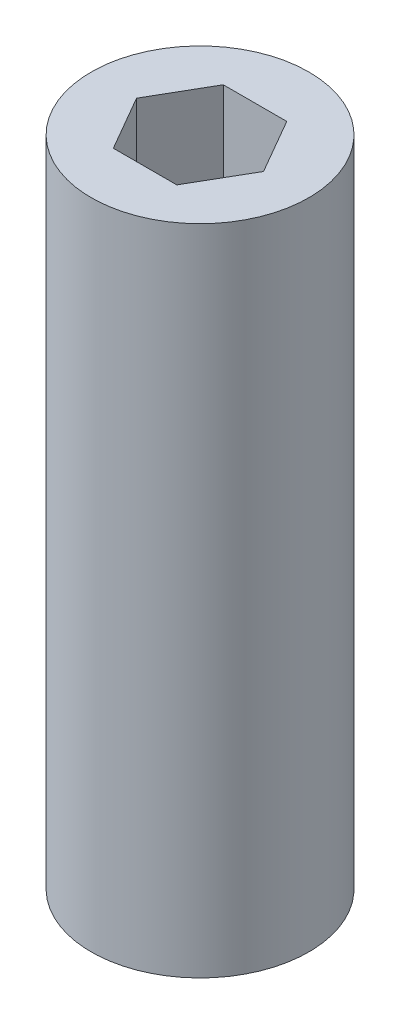
ISO-10303-21;
HEADER;
FILE_DESCRIPTION(('STEP AP214'),'2;1');
FILE_NAME('part.step','',(''),(''),'','','');
FILE_SCHEMA(('AUTOMOTIVE_DESIGN { 1 0 10303 214 1 1 1 1 }'));
ENDSEC;
DATA;
#1=APPLICATION_CONTEXT('core data for automotive mechanical design processes');
#2=APPLICATION_PROTOCOL_DEFINITION('international standard','automotive_design',2000,#1);
#3=PRODUCT_CONTEXT('',#1,'mechanical');
#4=PRODUCT('Part','Part','',(#3));
#5=PRODUCT_RELATED_PRODUCT_CATEGORY('part','',(#4));
#6=PRODUCT_DEFINITION_FORMATION('','',#4);
#7=PRODUCT_DEFINITION_CONTEXT('part definition',#1,'design');
#8=PRODUCT_DEFINITION('design','',#6,#7);
#9=PRODUCT_DEFINITION_SHAPE('','',#8);
#10=(LENGTH_UNIT() NAMED_UNIT(*) SI_UNIT(.MILLI.,.METRE.));
#11=(NAMED_UNIT(*) PLANE_ANGLE_UNIT() SI_UNIT($,.RADIAN.));
#12=(NAMED_UNIT(*) SI_UNIT($,.STERADIAN.) SOLID_ANGLE_UNIT());
#13=UNCERTAINTY_MEASURE_WITH_UNIT(LENGTH_MEASURE(1.E-05),#10,'distance_accuracy_value','');
#14=(GEOMETRIC_REPRESENTATION_CONTEXT(3) GLOBAL_UNCERTAINTY_ASSIGNED_CONTEXT((#13)) GLOBAL_UNIT_ASSIGNED_CONTEXT((#10,
#11,#12)) REPRESENTATION_CONTEXT('',''));
#15=CARTESIAN_POINT('',(0.,0.,0.));
#16=DIRECTION('',(0.,0.,1.));
#17=DIRECTION('',(1.,0.,0.));
#18=AXIS2_PLACEMENT_3D('',#15,#16,#17);
#19=CARTESIAN_POINT('',(0.,76.2,0.));
#20=DIRECTION('',(0.,-1.,0.));
#21=DIRECTION('',(0.,0.,-1.));
#22=AXIS2_PLACEMENT_3D('',#19,#20,#21);
#23=CYLINDRICAL_SURFACE('',#22,12.7);
#24=CARTESIAN_POINT('',(0.,76.2,0.));
#25=DIRECTION('',(0.,1.,0.));
#26=DIRECTION('',(0.,0.,1.));
#27=AXIS2_PLACEMENT_3D('',#24,#25,#26);
#28=CIRCLE('',#27,12.7);
#29=CARTESIAN_POINT('',(0.,76.2,-12.7));
#30=VERTEX_POINT('',#29);
#31=EDGE_CURVE('E11',#30,#30,#28,.T.);
#32=CARTESIAN_POINT('',(0.,0.,0.));
#33=DIRECTION('',(0.,1.,0.));
#34=DIRECTION('',(0.,0.,1.));
#35=AXIS2_PLACEMENT_3D('',#32,#33,#34);
#36=CIRCLE('',#35,12.7);
#37=CARTESIAN_POINT('',(0.,0.,-12.7));
#38=VERTEX_POINT('',#37);
#39=EDGE_CURVE('E42',#38,#38,#36,.T.);
#40=CARTESIAN_POINT('',(0.,76.2,-12.7));
#41=CARTESIAN_POINT('',(0.,75.40625,-12.7));
#42=CARTESIAN_POINT('',(0.,74.6125,-12.7));
#43=CARTESIAN_POINT('',(0.,73.025,-12.7));
#44=CARTESIAN_POINT('',(0.,72.23125,-12.7));
#45=CARTESIAN_POINT('',(0.,70.64375,-12.7));
#46=CARTESIAN_POINT('',(0.,69.85,-12.7));
#47=CARTESIAN_POINT('',(0.,68.2625,-12.7));
#48=CARTESIAN_POINT('',(0.,67.46875,-12.7));
#49=CARTESIAN_POINT('',(0.,65.88125,-12.7));
#50=CARTESIAN_POINT('',(0.,65.0875,-12.7));
#51=CARTESIAN_POINT('',(0.,63.5,-12.7));
#52=CARTESIAN_POINT('',(0.,62.70625,-12.7));
#53=CARTESIAN_POINT('',(0.,61.11875,-12.7));
#54=CARTESIAN_POINT('',(0.,60.325,-12.7));
#55=CARTESIAN_POINT('',(0.,58.7375,-12.7));
#56=CARTESIAN_POINT('',(0.,57.94375,-12.7));
#57=CARTESIAN_POINT('',(0.,56.35625,-12.7));
#58=CARTESIAN_POINT('',(0.,55.5625,-12.7));
#59=CARTESIAN_POINT('',(0.,53.975,-12.7));
#60=CARTESIAN_POINT('',(0.,53.18125,-12.7));
#61=CARTESIAN_POINT('',(0.,51.59375,-12.7));
#62=CARTESIAN_POINT('',(0.,50.8,-12.7));
#63=CARTESIAN_POINT('',(0.,49.2125,-12.7));
#64=CARTESIAN_POINT('',(0.,48.41875,-12.7));
#65=CARTESIAN_POINT('',(0.,46.83125,-12.7));
#66=CARTESIAN_POINT('',(0.,46.0375,-12.7));
#67=CARTESIAN_POINT('',(0.,44.45,-12.7));
#68=CARTESIAN_POINT('',(0.,43.65625,-12.7));
#69=CARTESIAN_POINT('',(0.,42.06875,-12.7));
#70=CARTESIAN_POINT('',(0.,41.275,-12.7));
#71=CARTESIAN_POINT('',(0.,39.6875,-12.7));
#72=CARTESIAN_POINT('',(0.,38.89375,-12.7));
#73=CARTESIAN_POINT('',(0.,37.30625,-12.7));
#74=CARTESIAN_POINT('',(0.,36.5125,-12.7));
#75=CARTESIAN_POINT('',(0.,34.925,-12.7));
#76=CARTESIAN_POINT('',(0.,34.13125,-12.7));
#77=CARTESIAN_POINT('',(0.,32.54375,-12.7));
#78=CARTESIAN_POINT('',(0.,31.75,-12.7));
#79=CARTESIAN_POINT('',(0.,30.1625,-12.7));
#80=CARTESIAN_POINT('',(0.,29.36875,-12.7));
#81=CARTESIAN_POINT('',(0.,27.78125,-12.7));
#82=CARTESIAN_POINT('',(0.,26.9875,-12.7));
#83=CARTESIAN_POINT('',(0.,25.4,-12.7));
#84=CARTESIAN_POINT('',(0.,24.60625,-12.7));
#85=CARTESIAN_POINT('',(0.,23.01875,-12.7));
#86=CARTESIAN_POINT('',(0.,22.225,-12.7));
#87=CARTESIAN_POINT('',(0.,20.6375,-12.7));
#88=CARTESIAN_POINT('',(0.,19.84375,-12.7));
#89=CARTESIAN_POINT('',(0.,18.25625,-12.7));
#90=CARTESIAN_POINT('',(0.,17.4625,-12.7));
#91=CARTESIAN_POINT('',(0.,15.875,-12.7));
#92=CARTESIAN_POINT('',(0.,15.08125,-12.7));
#93=CARTESIAN_POINT('',(0.,13.49375,-12.7));
#94=CARTESIAN_POINT('',(0.,12.7,-12.7));
#95=CARTESIAN_POINT('',(0.,11.1125,-12.7));
#96=CARTESIAN_POINT('',(0.,10.31875,-12.7));
#97=CARTESIAN_POINT('',(0.,8.73125,-12.7));
#98=CARTESIAN_POINT('',(0.,7.93750000000001,-12.7));
#99=CARTESIAN_POINT('',(0.,6.35,-12.7));
#100=CARTESIAN_POINT('',(0.,5.55625,-12.7));
#101=CARTESIAN_POINT('',(0.,3.96875,-12.7));
#102=CARTESIAN_POINT('',(0.,3.175,-12.7));
#103=CARTESIAN_POINT('',(0.,1.5875,-12.7));
#104=CARTESIAN_POINT('',(0.,0.793750000000001,-12.7));
#105=CARTESIAN_POINT('',(0.,0.,-12.7));
#106=B_SPLINE_CURVE_WITH_KNOTS('',3,(#40,#41,#42,#43,#44,#45,#46,#47,#48,#49,#50,#51,#52,#53,
#54,#55,#56,#57,#58,#59,#60,#61,#62,#63,#64,#65,#66,#67,#68,#69,#70,#71,#72,#73,#74,#75,#76,#77,
#78,#79,#80,#81,#82,#83,#84,#85,#86,#87,#88,#89,#90,#91,#92,#93,#94,#95,#96,#97,#98,#99,#100,
#101,#102,#103,#104,#105),.UNSPECIFIED.,.F.,.F.,(4,2,2,2,2,2,2,2,2,2,2,2,2,2,2,2,2,2,2,2,2,2,2,
2,2,2,2,2,2,2,2,2,4),(0.,2.38124999999999,4.76249999999999,7.14374999999999,9.52499999999999,
11.90625,14.2875,16.66875,19.05,21.43125,23.8125,26.19375,28.575,30.95625,33.3375,35.71875,38.1,
40.48125,42.8625,45.24375,47.625,50.00625,52.3875,54.76875,57.15,59.53125,61.9125,64.29375,
66.675,69.05625,71.4375,73.81875,76.2),.UNSPECIFIED.);
#107=EDGE_CURVE('BSEAM39',#30,#38,#106,.T.);
#108=ORIENTED_EDGE('',*,*,#31,.F.);
#109=ORIENTED_EDGE('',*,*,#39,.T.);
#110=ORIENTED_EDGE('',*,*,#107,.T.);
#111=ORIENTED_EDGE('',*,*,#107,.F.);
#112=EDGE_LOOP('',(#108,#110,#109,#111));
#113=FACE_BOUND('',#112,.T.);
#114=ADVANCED_FACE('F39',(#113),#23,.T.);
#115=CARTESIAN_POINT('',(0.,76.2,0.));
#116=DIRECTION('',(0.,1.,0.));
#117=DIRECTION('',(0.,0.,1.));
#118=AXIS2_PLACEMENT_3D('',#115,#116,#117);
#119=PLANE('',#118);
#120=DIRECTION('',(0.5,0.,0.866025403784438));
#121=VECTOR('',#120,1.);
#122=CARTESIAN_POINT('',(3.70283595144767,76.2,-6.4135));
#123=LINE('',#122,#121);
#124=CARTESIAN_POINT('',(3.70283595144767,76.2,-6.4135));
#125=VERTEX_POINT('',#124);
#126=CARTESIAN_POINT('',(7.40567190289533,76.2,0.));
#127=VERTEX_POINT('',#126);
#128=EDGE_CURVE('E94',#125,#127,#123,.T.);
#129=ORIENTED_EDGE('',*,*,#128,.T.);
#130=DIRECTION('',(-0.5,0.,0.866025403784439));
#131=VECTOR('',#130,1.);
#132=CARTESIAN_POINT('',(7.40567190289533,76.2,0.));
#133=LINE('',#132,#131);
#134=CARTESIAN_POINT('',(3.70283595144767,76.2,6.4135));
#135=VERTEX_POINT('',#134);
#136=EDGE_CURVE('E104',#127,#135,#133,.T.);
#137=ORIENTED_EDGE('',*,*,#136,.T.);
#138=DIRECTION('',(-1.,0.,0.));
#139=VECTOR('',#138,1.);
#140=CARTESIAN_POINT('',(3.70283595144767,76.2,6.4135));
#141=LINE('',#140,#139);
#142=CARTESIAN_POINT('',(-3.70283595144767,76.2,6.4135));
#143=VERTEX_POINT('',#142);
#144=EDGE_CURVE('E54',#135,#143,#141,.T.);
#145=ORIENTED_EDGE('',*,*,#144,.T.);
#146=DIRECTION('',(-0.5,0.,-0.866025403784439));
#147=VECTOR('',#146,1.);
#148=CARTESIAN_POINT('',(-3.70283595144767,76.2,6.4135));
#149=LINE('',#148,#147);
#150=CARTESIAN_POINT('',(-7.40567190289533,76.2,0.));
#151=VERTEX_POINT('',#150);
#152=EDGE_CURVE('E123',#143,#151,#149,.T.);
#153=ORIENTED_EDGE('',*,*,#152,.T.);
#154=DIRECTION('',(0.5,0.,-0.866025403784439));
#155=VECTOR('',#154,1.);
#156=CARTESIAN_POINT('',(-7.40567190289533,76.2,0.));
#157=LINE('',#156,#155);
#158=CARTESIAN_POINT('',(-3.70283595144767,76.2,-6.4135));
#159=VERTEX_POINT('',#158);
#160=EDGE_CURVE('E127',#151,#159,#157,.T.);
#161=ORIENTED_EDGE('',*,*,#160,.T.);
#162=DIRECTION('',(1.,0.,0.));
#163=VECTOR('',#162,1.);
#164=CARTESIAN_POINT('',(-3.70283595144767,76.2,-6.4135));
#165=LINE('',#164,#163);
#166=EDGE_CURVE('E101',#159,#125,#165,.T.);
#167=ORIENTED_EDGE('',*,*,#166,.T.);
#168=EDGE_LOOP('',(#129,#137,#145,#153,#161,#167));
#169=FACE_BOUND('',#168,.T.);
#170=ORIENTED_EDGE('',*,*,#31,.T.);
#171=EDGE_LOOP('',(#170));
#172=FACE_BOUND('',#171,.T.);
#173=ADVANCED_FACE('F109',(#169,#172),#119,.T.);
#174=CARTESIAN_POINT('',(0.,0.,0.));
#175=DIRECTION('',(0.,1.,0.));
#176=DIRECTION('',(0.,0.,1.));
#177=AXIS2_PLACEMENT_3D('',#174,#175,#176);
#178=PLANE('',#177);
#179=DIRECTION('',(-0.5,0.,0.866025403784439));
#180=VECTOR('',#179,1.);
#181=CARTESIAN_POINT('',(7.40567190289533,0.,0.));
#182=LINE('',#181,#180);
#183=CARTESIAN_POINT('',(7.40567190289533,0.,0.));
#184=VERTEX_POINT('',#183);
#185=CARTESIAN_POINT('',(3.70283595144767,0.,6.4135));
#186=VERTEX_POINT('',#185);
#187=EDGE_CURVE('E134',#184,#186,#182,.T.);
#188=ORIENTED_EDGE('',*,*,#187,.F.);
#189=DIRECTION('',(0.5,0.,0.866025403784438));
#190=VECTOR('',#189,1.);
#191=CARTESIAN_POINT('',(3.70283595144767,0.,-6.4135));
#192=LINE('',#191,#190);
#193=CARTESIAN_POINT('',(3.70283595144767,0.,-6.4135));
#194=VERTEX_POINT('',#193);
#195=EDGE_CURVE('E62',#194,#184,#192,.T.);
#196=ORIENTED_EDGE('',*,*,#195,.F.);
#197=DIRECTION('',(1.,0.,0.));
#198=VECTOR('',#197,1.);
#199=CARTESIAN_POINT('',(-3.70283595144767,0.,-6.4135));
#200=LINE('',#199,#198);
#201=CARTESIAN_POINT('',(-3.70283595144767,0.,-6.4135));
#202=VERTEX_POINT('',#201);
#203=EDGE_CURVE('E114',#202,#194,#200,.T.);
#204=ORIENTED_EDGE('',*,*,#203,.F.);
#205=DIRECTION('',(0.5,0.,-0.866025403784439));
#206=VECTOR('',#205,1.);
#207=CARTESIAN_POINT('',(-7.40567190289533,0.,0.));
#208=LINE('',#207,#206);
#209=CARTESIAN_POINT('',(-7.40567190289533,0.,0.));
#210=VERTEX_POINT('',#209);
#211=EDGE_CURVE('E118',#210,#202,#208,.T.);
#212=ORIENTED_EDGE('',*,*,#211,.F.);
#213=DIRECTION('',(-0.5,0.,-0.866025403784439));
#214=VECTOR('',#213,1.);
#215=CARTESIAN_POINT('',(-3.70283595144767,0.,6.4135));
#216=LINE('',#215,#214);
#217=CARTESIAN_POINT('',(-3.70283595144767,0.,6.4135));
#218=VERTEX_POINT('',#217);
#219=EDGE_CURVE('E141',#218,#210,#216,.T.);
#220=ORIENTED_EDGE('',*,*,#219,.F.);
#221=DIRECTION('',(-1.,0.,0.));
#222=VECTOR('',#221,1.);
#223=CARTESIAN_POINT('',(3.70283595144767,0.,6.4135));
#224=LINE('',#223,#222);
#225=EDGE_CURVE('E137',#186,#218,#224,.T.);
#226=ORIENTED_EDGE('',*,*,#225,.F.);
#227=EDGE_LOOP('',(#188,#196,#204,#212,#220,#226));
#228=FACE_BOUND('',#227,.T.);
#229=ORIENTED_EDGE('',*,*,#39,.F.);
#230=EDGE_LOOP('',(#229));
#231=FACE_BOUND('',#230,.T.);
#232=ADVANCED_FACE('F165',(#228,#231),#178,.F.);
#233=CARTESIAN_POINT('',(3.70283595144767,76.2,-6.4135));
#234=DIRECTION('',(0.866025403784439,0.,-0.5));
#235=DIRECTION('',(-0.5,0.,-0.866025403784438));
#236=AXIS2_PLACEMENT_3D('',#233,#234,#235);
#237=PLANE('',#236);
#238=ORIENTED_EDGE('',*,*,#195,.T.);
#239=DIRECTION('',(0.,-1.,0.));
#240=VECTOR('',#239,1.);
#241=CARTESIAN_POINT('',(7.40567190289533,76.2,0.));
#242=LINE('',#241,#240);
#243=EDGE_CURVE('E90',#127,#184,#242,.T.);
#244=ORIENTED_EDGE('',*,*,#243,.F.);
#245=ORIENTED_EDGE('',*,*,#128,.F.);
#246=DIRECTION('',(0.,-1.,0.));
#247=VECTOR('',#246,1.);
#248=CARTESIAN_POINT('',(3.70283595144767,76.2,-6.4135));
#249=LINE('',#248,#247);
#250=EDGE_CURVE('E148',#125,#194,#249,.T.);
#251=ORIENTED_EDGE('',*,*,#250,.T.);
#252=EDGE_LOOP('',(#238,#244,#245,#251));
#253=FACE_BOUND('',#252,.T.);
#254=ADVANCED_FACE('F92',(#253),#237,.F.);
#255=CARTESIAN_POINT('',(-3.70283595144767,76.2,-6.4135));
#256=DIRECTION('',(0.,0.,-1.));
#257=DIRECTION('',(-1.,0.,0.));
#258=AXIS2_PLACEMENT_3D('',#255,#256,#257);
#259=PLANE('',#258);
#260=ORIENTED_EDGE('',*,*,#203,.T.);
#261=ORIENTED_EDGE('',*,*,#250,.F.);
#262=ORIENTED_EDGE('',*,*,#166,.F.);
#263=DIRECTION('',(0.,-1.,0.));
#264=VECTOR('',#263,1.);
#265=CARTESIAN_POINT('',(-3.70283595144767,76.2,-6.4135));
#266=LINE('',#265,#264);
#267=EDGE_CURVE('E151',#159,#202,#266,.T.);
#268=ORIENTED_EDGE('',*,*,#267,.T.);
#269=EDGE_LOOP('',(#260,#261,#262,#268));
#270=FACE_BOUND('',#269,.T.);
#271=ADVANCED_FACE('F176',(#270),#259,.F.);
#272=CARTESIAN_POINT('',(-7.40567190289533,76.2,0.));
#273=DIRECTION('',(-0.866025403784439,0.,-0.5));
#274=DIRECTION('',(-0.5,0.,0.866025403784439));
#275=AXIS2_PLACEMENT_3D('',#272,#273,#274);
#276=PLANE('',#275);
#277=ORIENTED_EDGE('',*,*,#211,.T.);
#278=ORIENTED_EDGE('',*,*,#267,.F.);
#279=ORIENTED_EDGE('',*,*,#160,.F.);
#280=DIRECTION('',(0.,-1.,0.));
#281=VECTOR('',#280,1.);
#282=CARTESIAN_POINT('',(-7.40567190289533,76.2,0.));
#283=LINE('',#282,#281);
#284=EDGE_CURVE('E154',#151,#210,#283,.T.);
#285=ORIENTED_EDGE('',*,*,#284,.T.);
#286=EDGE_LOOP('',(#277,#278,#279,#285));
#287=FACE_BOUND('',#286,.T.);
#288=ADVANCED_FACE('F174',(#287),#276,.F.);
#289=CARTESIAN_POINT('',(-3.70283595144767,76.2,6.4135));
#290=DIRECTION('',(-0.866025403784439,0.,0.5));
#291=DIRECTION('',(0.5,0.,0.866025403784439));
#292=AXIS2_PLACEMENT_3D('',#289,#290,#291);
#293=PLANE('',#292);
#294=ORIENTED_EDGE('',*,*,#219,.T.);
#295=ORIENTED_EDGE('',*,*,#284,.F.);
#296=ORIENTED_EDGE('',*,*,#152,.F.);
#297=DIRECTION('',(0.,-1.,0.));
#298=VECTOR('',#297,1.);
#299=CARTESIAN_POINT('',(-3.70283595144767,76.2,6.4135));
#300=LINE('',#299,#298);
#301=EDGE_CURVE('E157',#143,#218,#300,.T.);
#302=ORIENTED_EDGE('',*,*,#301,.T.);
#303=EDGE_LOOP('',(#294,#295,#296,#302));
#304=FACE_BOUND('',#303,.T.);
#305=ADVANCED_FACE('F170',(#304),#293,.F.);
#306=CARTESIAN_POINT('',(3.70283595144767,76.2,6.4135));
#307=DIRECTION('',(0.,0.,1.));
#308=DIRECTION('',(1.,0.,0.));
#309=AXIS2_PLACEMENT_3D('',#306,#307,#308);
#310=PLANE('',#309);
#311=ORIENTED_EDGE('',*,*,#225,.T.);
#312=ORIENTED_EDGE('',*,*,#301,.F.);
#313=ORIENTED_EDGE('',*,*,#144,.F.);
#314=DIRECTION('',(0.,-1.,0.));
#315=VECTOR('',#314,1.);
#316=CARTESIAN_POINT('',(3.70283595144767,76.2,6.4135));
#317=LINE('',#316,#315);
#318=EDGE_CURVE('E100',#135,#186,#317,.T.);
#319=ORIENTED_EDGE('',*,*,#318,.T.);
#320=EDGE_LOOP('',(#311,#312,#313,#319));
#321=FACE_BOUND('',#320,.T.);
#322=ADVANCED_FACE('F161',(#321),#310,.F.);
#323=CARTESIAN_POINT('',(7.40567190289533,76.2,0.));
#324=DIRECTION('',(0.866025403784439,0.,0.5));
#325=DIRECTION('',(0.5,0.,-0.866025403784439));
#326=AXIS2_PLACEMENT_3D('',#323,#324,#325);
#327=PLANE('',#326);
#328=ORIENTED_EDGE('',*,*,#187,.T.);
#329=ORIENTED_EDGE('',*,*,#318,.F.);
#330=ORIENTED_EDGE('',*,*,#136,.F.);
#331=ORIENTED_EDGE('',*,*,#243,.T.);
#332=EDGE_LOOP('',(#328,#329,#330,#331));
#333=FACE_BOUND('',#332,.T.);
#334=ADVANCED_FACE('F105',(#333),#327,.F.);
#335=CLOSED_SHELL('',(#114,#173,#232,#254,#271,#288,#305,#322,#334));
#336=MANIFOLD_SOLID_BREP('B2',#335);
#337=ADVANCED_BREP_SHAPE_REPRESENTATION('',(#18,#336),#14);
#338=SHAPE_DEFINITION_REPRESENTATION(#9,#337);
ENDSEC;
END-ISO-10303-21;
